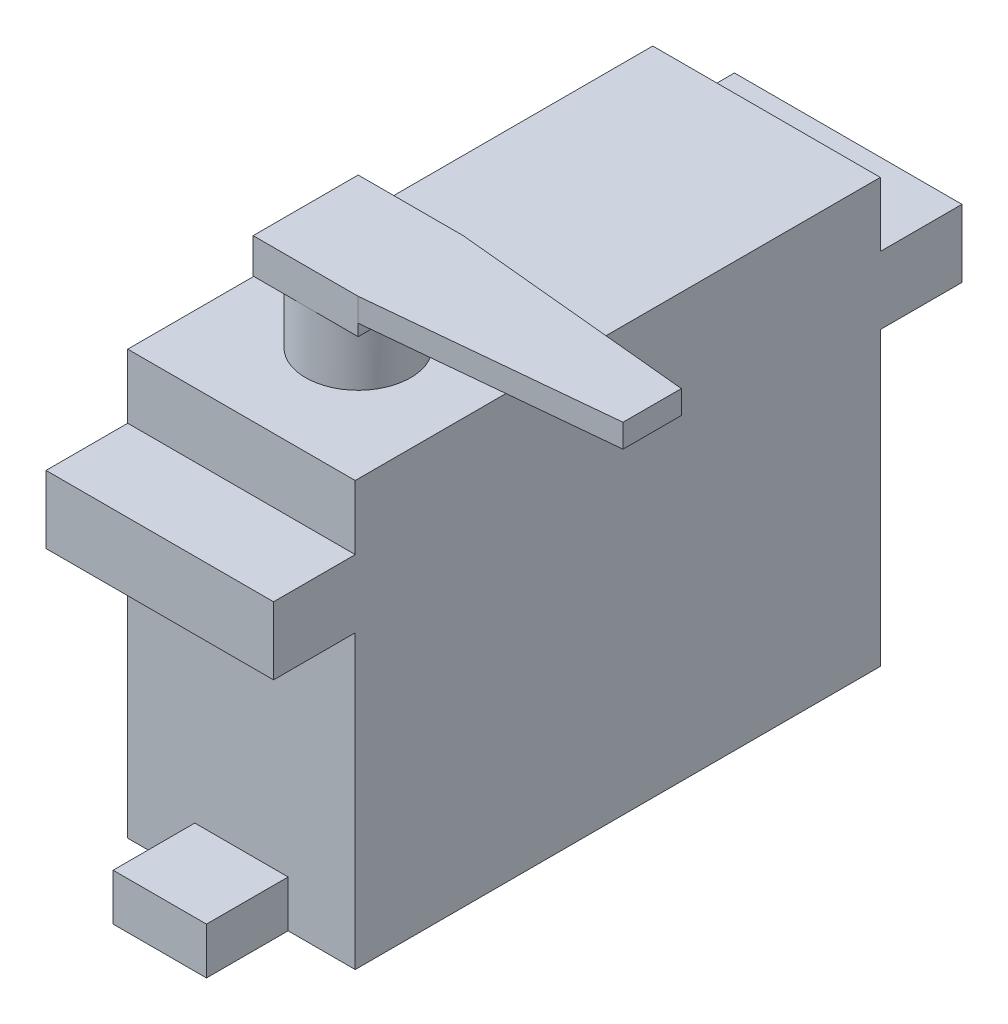
ISO-10303-21;
HEADER;
FILE_DESCRIPTION(('STEP AP214'),'2;1');
FILE_NAME('part.step','',(''),(''),'','','');
FILE_SCHEMA(('AUTOMOTIVE_DESIGN { 1 0 10303 214 1 1 1 1 }'));
ENDSEC;
DATA;
#1=APPLICATION_CONTEXT('core data for automotive mechanical design processes');
#2=APPLICATION_PROTOCOL_DEFINITION('international standard','automotive_design',2000,#1);
#3=PRODUCT_CONTEXT('',#1,'mechanical');
#4=PRODUCT('Part','Part','',(#3));
#5=PRODUCT_RELATED_PRODUCT_CATEGORY('part','',(#4));
#6=PRODUCT_DEFINITION_FORMATION('','',#4);
#7=PRODUCT_DEFINITION_CONTEXT('part definition',#1,'design');
#8=PRODUCT_DEFINITION('design','',#6,#7);
#9=PRODUCT_DEFINITION_SHAPE('','',#8);
#10=(LENGTH_UNIT() NAMED_UNIT(*) SI_UNIT(.MILLI.,.METRE.));
#11=(NAMED_UNIT(*) PLANE_ANGLE_UNIT() SI_UNIT($,.RADIAN.));
#12=(NAMED_UNIT(*) SI_UNIT($,.STERADIAN.) SOLID_ANGLE_UNIT());
#13=UNCERTAINTY_MEASURE_WITH_UNIT(LENGTH_MEASURE(1.E-05),#10,'distance_accuracy_value','');
#14=(GEOMETRIC_REPRESENTATION_CONTEXT(3) GLOBAL_UNCERTAINTY_ASSIGNED_CONTEXT((#13)) GLOBAL_UNIT_ASSIGNED_CONTEXT((#10,
#11,#12)) REPRESENTATION_CONTEXT('',''));
#15=CARTESIAN_POINT('',(0.,0.,0.));
#16=DIRECTION('',(0.,0.,1.));
#17=DIRECTION('',(1.,0.,0.));
#18=AXIS2_PLACEMENT_3D('',#15,#16,#17);
#19=CARTESIAN_POINT('',(19.5,36.3,-45.));
#20=DIRECTION('',(0.,-1.,0.));
#21=DIRECTION('',(0.,0.,-1.));
#22=AXIS2_PLACEMENT_3D('',#19,#20,#21);
#23=PLANE('',#22);
#24=DIRECTION('',(0.,0.,1.));
#25=VECTOR('',#24,1.);
#26=CARTESIAN_POINT('',(0.,36.3,-45.));
#27=LINE('',#26,#25);
#28=CARTESIAN_POINT('',(0.,36.3,-45.));
#29=VERTEX_POINT('',#28);
#30=CARTESIAN_POINT('',(0.,36.3,0.));
#31=VERTEX_POINT('',#30);
#32=EDGE_CURVE('E329',#29,#31,#27,.T.);
#33=ORIENTED_EDGE('',*,*,#32,.T.);
#34=DIRECTION('',(-1.,0.,0.));
#35=VECTOR('',#34,1.);
#36=CARTESIAN_POINT('',(19.5,36.3,0.));
#37=LINE('',#36,#35);
#38=CARTESIAN_POINT('',(19.5,36.3,0.));
#39=VERTEX_POINT('',#38);
#40=EDGE_CURVE('E349',#39,#31,#37,.T.);
#41=ORIENTED_EDGE('',*,*,#40,.F.);
#42=DIRECTION('',(0.,0.,1.));
#43=VECTOR('',#42,1.);
#44=CARTESIAN_POINT('',(19.5,36.3,-45.));
#45=LINE('',#44,#43);
#46=CARTESIAN_POINT('',(19.5,36.3,-45.));
#47=VERTEX_POINT('',#46);
#48=EDGE_CURVE('E304',#47,#39,#45,.T.);
#49=ORIENTED_EDGE('',*,*,#48,.F.);
#50=DIRECTION('',(-1.,0.,0.));
#51=VECTOR('',#50,1.);
#52=CARTESIAN_POINT('',(19.5,36.3,-45.));
#53=LINE('',#52,#51);
#54=EDGE_CURVE('E352',#47,#29,#53,.T.);
#55=ORIENTED_EDGE('',*,*,#54,.T.);
#56=EDGE_LOOP('',(#33,#41,#49,#55));
#57=FACE_BOUND('',#56,.T.);
#58=CARTESIAN_POINT('',(9.75,36.3,-10.));
#59=DIRECTION('',(0.,-1.,0.));
#60=DIRECTION('',(0.,0.,-1.));
#61=AXIS2_PLACEMENT_3D('',#58,#59,#60);
#62=CIRCLE('',#61,4.5);
#63=CARTESIAN_POINT('',(9.75,36.3,-14.5));
#64=VERTEX_POINT('',#63);
#65=EDGE_CURVE('E11',#64,#64,#62,.F.);
#66=ORIENTED_EDGE('',*,*,#65,.F.);
#67=EDGE_LOOP('',(#66));
#68=FACE_BOUND('',#67,.T.);
#69=ADVANCED_FACE('F32',(#57,#68),#23,.F.);
#70=CARTESIAN_POINT('',(19.5,25.,0.));
#71=DIRECTION('',(0.,0.,-1.));
#72=DIRECTION('',(-1.,0.,0.));
#73=AXIS2_PLACEMENT_3D('',#70,#71,#72);
#74=PLANE('',#73);
#75=DIRECTION('',(0.,1.,0.));
#76=VECTOR('',#75,1.);
#77=CARTESIAN_POINT('',(13.75,4.,0.));
#78=LINE('',#77,#76);
#79=CARTESIAN_POINT('',(13.75,0.,0.));
#80=VERTEX_POINT('',#79);
#81=CARTESIAN_POINT('',(13.75,4.,0.));
#82=VERTEX_POINT('',#81);
#83=EDGE_CURVE('E260',#80,#82,#78,.T.);
#84=ORIENTED_EDGE('',*,*,#83,.F.);
#85=DIRECTION('',(-1.,0.,0.));
#86=VECTOR('',#85,1.);
#87=CARTESIAN_POINT('',(19.5,0.,0.));
#88=LINE('',#87,#86);
#89=CARTESIAN_POINT('',(19.5,0.,0.));
#90=VERTEX_POINT('',#89);
#91=EDGE_CURVE('E40',#90,#80,#88,.T.);
#92=ORIENTED_EDGE('',*,*,#91,.F.);
#93=DIRECTION('',(0.,-1.,0.));
#94=VECTOR('',#93,1.);
#95=CARTESIAN_POINT('',(19.5,25.,0.));
#96=LINE('',#95,#94);
#97=CARTESIAN_POINT('',(19.5,25.,0.));
#98=VERTEX_POINT('',#97);
#99=EDGE_CURVE('E288',#98,#90,#96,.T.);
#100=ORIENTED_EDGE('',*,*,#99,.F.);
#101=DIRECTION('',(-1.,0.,0.));
#102=VECTOR('',#101,1.);
#103=CARTESIAN_POINT('',(19.5,25.,0.));
#104=LINE('',#103,#102);
#105=CARTESIAN_POINT('',(0.,25.,0.));
#106=VERTEX_POINT('',#105);
#107=EDGE_CURVE('E314',#98,#106,#104,.T.);
#108=ORIENTED_EDGE('',*,*,#107,.T.);
#109=DIRECTION('',(0.,-1.,0.));
#110=VECTOR('',#109,1.);
#111=CARTESIAN_POINT('',(0.,25.,0.));
#112=LINE('',#111,#110);
#113=CARTESIAN_POINT('',(0.,0.,0.));
#114=VERTEX_POINT('',#113);
#115=EDGE_CURVE('E287',#106,#114,#112,.T.);
#116=ORIENTED_EDGE('',*,*,#115,.T.);
#117=CARTESIAN_POINT('',(5.75,0.,0.));
#118=VERTEX_POINT('',#117);
#119=EDGE_CURVE('E369',#118,#114,#88,.T.);
#120=ORIENTED_EDGE('',*,*,#119,.F.);
#121=DIRECTION('',(0.,-1.,0.));
#122=VECTOR('',#121,1.);
#123=CARTESIAN_POINT('',(5.75,4.,0.));
#124=LINE('',#123,#122);
#125=CARTESIAN_POINT('',(5.75,4.,0.));
#126=VERTEX_POINT('',#125);
#127=EDGE_CURVE('E266',#126,#118,#124,.T.);
#128=ORIENTED_EDGE('',*,*,#127,.F.);
#129=DIRECTION('',(-1.,0.,0.));
#130=VECTOR('',#129,1.);
#131=CARTESIAN_POINT('',(5.75,4.,0.));
#132=LINE('',#131,#130);
#133=EDGE_CURVE('E275',#82,#126,#132,.T.);
#134=ORIENTED_EDGE('',*,*,#133,.F.);
#135=EDGE_LOOP('',(#84,#92,#100,#108,#116,#120,#128,#134));
#136=FACE_BOUND('',#135,.T.);
#137=ADVANCED_FACE('F34',(#136),#74,.F.);
#138=CARTESIAN_POINT('',(19.5,0.,0.));
#139=DIRECTION('',(0.,1.,0.));
#140=DIRECTION('',(0.,0.,1.));
#141=AXIS2_PLACEMENT_3D('',#138,#139,#140);
#142=PLANE('',#141);
#143=DIRECTION('',(0.,0.,-1.));
#144=VECTOR('',#143,1.);
#145=CARTESIAN_POINT('',(0.,0.,0.));
#146=LINE('',#145,#144);
#147=CARTESIAN_POINT('',(0.,0.,-45.));
#148=VERTEX_POINT('',#147);
#149=EDGE_CURVE('E317',#114,#148,#146,.T.);
#150=ORIENTED_EDGE('',*,*,#149,.T.);
#151=DIRECTION('',(-1.,0.,0.));
#152=VECTOR('',#151,1.);
#153=CARTESIAN_POINT('',(19.5,0.,-45.));
#154=LINE('',#153,#152);
#155=CARTESIAN_POINT('',(19.5,0.,-45.));
#156=VERTEX_POINT('',#155);
#157=EDGE_CURVE('E367',#156,#148,#154,.T.);
#158=ORIENTED_EDGE('',*,*,#157,.F.);
#159=DIRECTION('',(0.,0.,-1.));
#160=VECTOR('',#159,1.);
#161=CARTESIAN_POINT('',(19.5,0.,0.));
#162=LINE('',#161,#160);
#163=EDGE_CURVE('E291',#90,#156,#162,.T.);
#164=ORIENTED_EDGE('',*,*,#163,.F.);
#165=ORIENTED_EDGE('',*,*,#91,.T.);
#166=DIRECTION('',(0.,0.,-1.));
#167=VECTOR('',#166,1.);
#168=CARTESIAN_POINT('',(13.75,0.,7.));
#169=LINE('',#168,#167);
#170=CARTESIAN_POINT('',(13.75,0.,7.));
#171=VERTEX_POINT('',#170);
#172=EDGE_CURVE('E272',#171,#80,#169,.T.);
#173=ORIENTED_EDGE('',*,*,#172,.F.);
#174=DIRECTION('',(1.,0.,0.));
#175=VECTOR('',#174,1.);
#176=CARTESIAN_POINT('',(5.75,0.,7.));
#177=LINE('',#176,#175);
#178=CARTESIAN_POINT('',(5.75,0.,7.));
#179=VERTEX_POINT('',#178);
#180=EDGE_CURVE('E270',#179,#171,#177,.T.);
#181=ORIENTED_EDGE('',*,*,#180,.F.);
#182=DIRECTION('',(0.,0.,-1.));
#183=VECTOR('',#182,1.);
#184=CARTESIAN_POINT('',(5.75,0.,7.));
#185=LINE('',#184,#183);
#186=EDGE_CURVE('E280',#179,#118,#185,.T.);
#187=ORIENTED_EDGE('',*,*,#186,.T.);
#188=ORIENTED_EDGE('',*,*,#119,.T.);
#189=EDGE_LOOP('',(#150,#158,#164,#165,#173,#181,#187,#188));
#190=FACE_BOUND('',#189,.T.);
#191=ADVANCED_FACE('F376',(#190),#142,.F.);
#192=CARTESIAN_POINT('',(19.5,0.,-45.));
#193=DIRECTION('',(0.,0.,1.));
#194=DIRECTION('',(1.,0.,0.));
#195=AXIS2_PLACEMENT_3D('',#192,#193,#194);
#196=PLANE('',#195);
#197=DIRECTION('',(0.,1.,0.));
#198=VECTOR('',#197,1.);
#199=CARTESIAN_POINT('',(0.,0.,-45.));
#200=LINE('',#199,#198);
#201=CARTESIAN_POINT('',(0.,25.,-45.));
#202=VERTEX_POINT('',#201);
#203=EDGE_CURVE('E319',#148,#202,#200,.T.);
#204=ORIENTED_EDGE('',*,*,#203,.T.);
#205=DIRECTION('',(-1.,0.,0.));
#206=VECTOR('',#205,1.);
#207=CARTESIAN_POINT('',(19.5,25.,-45.));
#208=LINE('',#207,#206);
#209=CARTESIAN_POINT('',(19.5,25.,-45.));
#210=VERTEX_POINT('',#209);
#211=EDGE_CURVE('E364',#210,#202,#208,.T.);
#212=ORIENTED_EDGE('',*,*,#211,.F.);
#213=DIRECTION('',(0.,1.,0.));
#214=VECTOR('',#213,1.);
#215=CARTESIAN_POINT('',(19.5,0.,-45.));
#216=LINE('',#215,#214);
#217=EDGE_CURVE('E294',#156,#210,#216,.T.);
#218=ORIENTED_EDGE('',*,*,#217,.F.);
#219=ORIENTED_EDGE('',*,*,#157,.T.);
#220=EDGE_LOOP('',(#204,#212,#218,#219));
#221=FACE_BOUND('',#220,.T.);
#222=ADVANCED_FACE('F436',(#221),#196,.F.);
#223=CARTESIAN_POINT('',(19.5,25.,-45.));
#224=DIRECTION('',(0.,1.,0.));
#225=DIRECTION('',(0.,0.,1.));
#226=AXIS2_PLACEMENT_3D('',#223,#224,#225);
#227=PLANE('',#226);
#228=DIRECTION('',(0.,0.,-1.));
#229=VECTOR('',#228,1.);
#230=CARTESIAN_POINT('',(0.,25.,-45.));
#231=LINE('',#230,#229);
#232=CARTESIAN_POINT('',(0.,25.,-52.));
#233=VERTEX_POINT('',#232);
#234=EDGE_CURVE('E321',#202,#233,#231,.T.);
#235=ORIENTED_EDGE('',*,*,#234,.T.);
#236=DIRECTION('',(-1.,0.,0.));
#237=VECTOR('',#236,1.);
#238=CARTESIAN_POINT('',(19.5,25.,-52.));
#239=LINE('',#238,#237);
#240=CARTESIAN_POINT('',(19.5,25.,-52.));
#241=VERTEX_POINT('',#240);
#242=EDGE_CURVE('E361',#241,#233,#239,.T.);
#243=ORIENTED_EDGE('',*,*,#242,.F.);
#244=DIRECTION('',(0.,0.,-1.));
#245=VECTOR('',#244,1.);
#246=CARTESIAN_POINT('',(19.5,25.,-45.));
#247=LINE('',#246,#245);
#248=EDGE_CURVE('E296',#210,#241,#247,.T.);
#249=ORIENTED_EDGE('',*,*,#248,.F.);
#250=ORIENTED_EDGE('',*,*,#211,.T.);
#251=EDGE_LOOP('',(#235,#243,#249,#250));
#252=FACE_BOUND('',#251,.T.);
#253=ADVANCED_FACE('F432',(#252),#227,.F.);
#254=CARTESIAN_POINT('',(19.5,25.,-52.));
#255=DIRECTION('',(0.,0.,1.));
#256=DIRECTION('',(1.,0.,0.));
#257=AXIS2_PLACEMENT_3D('',#254,#255,#256);
#258=PLANE('',#257);
#259=DIRECTION('',(0.,1.,0.));
#260=VECTOR('',#259,1.);
#261=CARTESIAN_POINT('',(0.,25.,-52.));
#262=LINE('',#261,#260);
#263=CARTESIAN_POINT('',(0.,30.8,-52.));
#264=VERTEX_POINT('',#263);
#265=EDGE_CURVE('E323',#233,#264,#262,.T.);
#266=ORIENTED_EDGE('',*,*,#265,.T.);
#267=DIRECTION('',(-1.,0.,0.));
#268=VECTOR('',#267,1.);
#269=CARTESIAN_POINT('',(19.5,30.8,-52.));
#270=LINE('',#269,#268);
#271=CARTESIAN_POINT('',(19.5,30.8,-52.));
#272=VERTEX_POINT('',#271);
#273=EDGE_CURVE('E358',#272,#264,#270,.T.);
#274=ORIENTED_EDGE('',*,*,#273,.F.);
#275=DIRECTION('',(0.,1.,0.));
#276=VECTOR('',#275,1.);
#277=CARTESIAN_POINT('',(19.5,25.,-52.));
#278=LINE('',#277,#276);
#279=EDGE_CURVE('E298',#241,#272,#278,.T.);
#280=ORIENTED_EDGE('',*,*,#279,.F.);
#281=ORIENTED_EDGE('',*,*,#242,.T.);
#282=EDGE_LOOP('',(#266,#274,#280,#281));
#283=FACE_BOUND('',#282,.T.);
#284=ADVANCED_FACE('F427',(#283),#258,.F.);
#285=CARTESIAN_POINT('',(19.5,30.8,-52.));
#286=DIRECTION('',(0.,-1.,0.));
#287=DIRECTION('',(0.,0.,-1.));
#288=AXIS2_PLACEMENT_3D('',#285,#286,#287);
#289=PLANE('',#288);
#290=DIRECTION('',(0.,0.,1.));
#291=VECTOR('',#290,1.);
#292=CARTESIAN_POINT('',(0.,30.8,-52.));
#293=LINE('',#292,#291);
#294=CARTESIAN_POINT('',(0.,30.8,-45.));
#295=VERTEX_POINT('',#294);
#296=EDGE_CURVE('E325',#264,#295,#293,.T.);
#297=ORIENTED_EDGE('',*,*,#296,.T.);
#298=DIRECTION('',(-1.,0.,0.));
#299=VECTOR('',#298,1.);
#300=CARTESIAN_POINT('',(19.5,30.8,-45.));
#301=LINE('',#300,#299);
#302=CARTESIAN_POINT('',(19.5,30.8,-45.));
#303=VERTEX_POINT('',#302);
#304=EDGE_CURVE('E355',#303,#295,#301,.T.);
#305=ORIENTED_EDGE('',*,*,#304,.F.);
#306=DIRECTION('',(0.,0.,1.));
#307=VECTOR('',#306,1.);
#308=CARTESIAN_POINT('',(19.5,30.8,-52.));
#309=LINE('',#308,#307);
#310=EDGE_CURVE('E300',#272,#303,#309,.T.);
#311=ORIENTED_EDGE('',*,*,#310,.F.);
#312=ORIENTED_EDGE('',*,*,#273,.T.);
#313=EDGE_LOOP('',(#297,#305,#311,#312));
#314=FACE_BOUND('',#313,.T.);
#315=ADVANCED_FACE('F423',(#314),#289,.F.);
#316=CARTESIAN_POINT('',(19.5,30.8,-45.));
#317=DIRECTION('',(0.,0.,1.));
#318=DIRECTION('',(1.,0.,0.));
#319=AXIS2_PLACEMENT_3D('',#316,#317,#318);
#320=PLANE('',#319);
#321=DIRECTION('',(0.,1.,0.));
#322=VECTOR('',#321,1.);
#323=CARTESIAN_POINT('',(0.,30.8,-45.));
#324=LINE('',#323,#322);
#325=EDGE_CURVE('E327',#295,#29,#324,.T.);
#326=ORIENTED_EDGE('',*,*,#325,.T.);
#327=ORIENTED_EDGE('',*,*,#54,.F.);
#328=DIRECTION('',(0.,1.,0.));
#329=VECTOR('',#328,1.);
#330=CARTESIAN_POINT('',(19.5,30.8,-45.));
#331=LINE('',#330,#329);
#332=EDGE_CURVE('E302',#303,#47,#331,.T.);
#333=ORIENTED_EDGE('',*,*,#332,.F.);
#334=ORIENTED_EDGE('',*,*,#304,.T.);
#335=EDGE_LOOP('',(#326,#327,#333,#334));
#336=FACE_BOUND('',#335,.T.);
#337=ADVANCED_FACE('F419',(#336),#320,.F.);
#338=CARTESIAN_POINT('',(19.5,36.3,0.));
#339=DIRECTION('',(0.,0.,-1.));
#340=DIRECTION('',(-1.,0.,0.));
#341=AXIS2_PLACEMENT_3D('',#338,#339,#340);
#342=PLANE('',#341);
#343=DIRECTION('',(0.,-1.,0.));
#344=VECTOR('',#343,1.);
#345=CARTESIAN_POINT('',(0.,36.3,0.));
#346=LINE('',#345,#344);
#347=CARTESIAN_POINT('',(0.,30.8,0.));
#348=VERTEX_POINT('',#347);
#349=EDGE_CURVE('E331',#31,#348,#346,.T.);
#350=ORIENTED_EDGE('',*,*,#349,.T.);
#351=DIRECTION('',(-1.,0.,0.));
#352=VECTOR('',#351,1.);
#353=CARTESIAN_POINT('',(19.5,30.8,0.));
#354=LINE('',#353,#352);
#355=CARTESIAN_POINT('',(19.5,30.8,0.));
#356=VERTEX_POINT('',#355);
#357=EDGE_CURVE('E346',#356,#348,#354,.T.);
#358=ORIENTED_EDGE('',*,*,#357,.F.);
#359=DIRECTION('',(0.,-1.,0.));
#360=VECTOR('',#359,1.);
#361=CARTESIAN_POINT('',(19.5,36.3,0.));
#362=LINE('',#361,#360);
#363=EDGE_CURVE('E306',#39,#356,#362,.T.);
#364=ORIENTED_EDGE('',*,*,#363,.F.);
#365=ORIENTED_EDGE('',*,*,#40,.T.);
#366=EDGE_LOOP('',(#350,#358,#364,#365));
#367=FACE_BOUND('',#366,.T.);
#368=ADVANCED_FACE('F408',(#367),#342,.F.);
#369=CARTESIAN_POINT('',(19.5,30.8,0.));
#370=DIRECTION('',(0.,-1.,0.));
#371=DIRECTION('',(0.,0.,-1.));
#372=AXIS2_PLACEMENT_3D('',#369,#370,#371);
#373=PLANE('',#372);
#374=DIRECTION('',(0.,0.,1.));
#375=VECTOR('',#374,1.);
#376=CARTESIAN_POINT('',(0.,30.8,0.));
#377=LINE('',#376,#375);
#378=CARTESIAN_POINT('',(0.,30.8,7.));
#379=VERTEX_POINT('',#378);
#380=EDGE_CURVE('E333',#348,#379,#377,.T.);
#381=ORIENTED_EDGE('',*,*,#380,.T.);
#382=DIRECTION('',(-1.,0.,0.));
#383=VECTOR('',#382,1.);
#384=CARTESIAN_POINT('',(19.5,30.8,7.));
#385=LINE('',#384,#383);
#386=CARTESIAN_POINT('',(19.5,30.8,7.));
#387=VERTEX_POINT('',#386);
#388=EDGE_CURVE('E343',#387,#379,#385,.T.);
#389=ORIENTED_EDGE('',*,*,#388,.F.);
#390=DIRECTION('',(0.,0.,1.));
#391=VECTOR('',#390,1.);
#392=CARTESIAN_POINT('',(19.5,30.8,0.));
#393=LINE('',#392,#391);
#394=EDGE_CURVE('E308',#356,#387,#393,.T.);
#395=ORIENTED_EDGE('',*,*,#394,.F.);
#396=ORIENTED_EDGE('',*,*,#357,.T.);
#397=EDGE_LOOP('',(#381,#389,#395,#396));
#398=FACE_BOUND('',#397,.T.);
#399=ADVANCED_FACE('F404',(#398),#373,.F.);
#400=CARTESIAN_POINT('',(19.5,30.8,7.));
#401=DIRECTION('',(0.,0.,-1.));
#402=DIRECTION('',(-1.,0.,0.));
#403=AXIS2_PLACEMENT_3D('',#400,#401,#402);
#404=PLANE('',#403);
#405=DIRECTION('',(0.,-1.,0.));
#406=VECTOR('',#405,1.);
#407=CARTESIAN_POINT('',(0.,30.8,7.));
#408=LINE('',#407,#406);
#409=CARTESIAN_POINT('',(0.,25.,7.));
#410=VERTEX_POINT('',#409);
#411=EDGE_CURVE('E335',#379,#410,#408,.T.);
#412=ORIENTED_EDGE('',*,*,#411,.T.);
#413=DIRECTION('',(-1.,0.,0.));
#414=VECTOR('',#413,1.);
#415=CARTESIAN_POINT('',(19.5,25.,7.));
#416=LINE('',#415,#414);
#417=CARTESIAN_POINT('',(19.5,25.,7.));
#418=VERTEX_POINT('',#417);
#419=EDGE_CURVE('E340',#418,#410,#416,.T.);
#420=ORIENTED_EDGE('',*,*,#419,.F.);
#421=DIRECTION('',(0.,-1.,0.));
#422=VECTOR('',#421,1.);
#423=CARTESIAN_POINT('',(19.5,30.8,7.));
#424=LINE('',#423,#422);
#425=EDGE_CURVE('E310',#387,#418,#424,.T.);
#426=ORIENTED_EDGE('',*,*,#425,.F.);
#427=ORIENTED_EDGE('',*,*,#388,.T.);
#428=EDGE_LOOP('',(#412,#420,#426,#427));
#429=FACE_BOUND('',#428,.T.);
#430=ADVANCED_FACE('F399',(#429),#404,.F.);
#431=CARTESIAN_POINT('',(19.5,25.,7.));
#432=DIRECTION('',(0.,1.,0.));
#433=DIRECTION('',(0.,0.,1.));
#434=AXIS2_PLACEMENT_3D('',#431,#432,#433);
#435=PLANE('',#434);
#436=DIRECTION('',(0.,0.,-1.));
#437=VECTOR('',#436,1.);
#438=CARTESIAN_POINT('',(0.,25.,7.));
#439=LINE('',#438,#437);
#440=EDGE_CURVE('E292',#410,#106,#439,.T.);
#441=ORIENTED_EDGE('',*,*,#440,.T.);
#442=ORIENTED_EDGE('',*,*,#107,.F.);
#443=DIRECTION('',(0.,0.,-1.));
#444=VECTOR('',#443,1.);
#445=CARTESIAN_POINT('',(19.5,25.,7.));
#446=LINE('',#445,#444);
#447=EDGE_CURVE('E312',#418,#98,#446,.T.);
#448=ORIENTED_EDGE('',*,*,#447,.F.);
#449=ORIENTED_EDGE('',*,*,#419,.T.);
#450=EDGE_LOOP('',(#441,#442,#448,#449));
#451=FACE_BOUND('',#450,.T.);
#452=ADVANCED_FACE('F393',(#451),#435,.F.);
#453=CARTESIAN_POINT('',(19.5,0.,0.));
#454=DIRECTION('',(1.,0.,0.));
#455=DIRECTION('',(0.,0.,-1.));
#456=AXIS2_PLACEMENT_3D('',#453,#454,#455);
#457=PLANE('',#456);
#458=ORIENTED_EDGE('',*,*,#99,.T.);
#459=ORIENTED_EDGE('',*,*,#163,.T.);
#460=ORIENTED_EDGE('',*,*,#217,.T.);
#461=ORIENTED_EDGE('',*,*,#248,.T.);
#462=ORIENTED_EDGE('',*,*,#279,.T.);
#463=ORIENTED_EDGE('',*,*,#310,.T.);
#464=ORIENTED_EDGE('',*,*,#332,.T.);
#465=ORIENTED_EDGE('',*,*,#48,.T.);
#466=ORIENTED_EDGE('',*,*,#363,.T.);
#467=ORIENTED_EDGE('',*,*,#394,.T.);
#468=ORIENTED_EDGE('',*,*,#425,.T.);
#469=ORIENTED_EDGE('',*,*,#447,.T.);
#470=EDGE_LOOP('',(#458,#459,#460,#461,#462,#463,#464,#465,#466,#467,#468,#469));
#471=FACE_BOUND('',#470,.T.);
#472=ADVANCED_FACE('F438',(#471),#457,.T.);
#473=CARTESIAN_POINT('',(0.,0.,0.));
#474=DIRECTION('',(1.,0.,0.));
#475=DIRECTION('',(0.,0.,-1.));
#476=AXIS2_PLACEMENT_3D('',#473,#474,#475);
#477=PLANE('',#476);
#478=ORIENTED_EDGE('',*,*,#115,.F.);
#479=ORIENTED_EDGE('',*,*,#440,.F.);
#480=ORIENTED_EDGE('',*,*,#411,.F.);
#481=ORIENTED_EDGE('',*,*,#380,.F.);
#482=ORIENTED_EDGE('',*,*,#349,.F.);
#483=ORIENTED_EDGE('',*,*,#32,.F.);
#484=ORIENTED_EDGE('',*,*,#325,.F.);
#485=ORIENTED_EDGE('',*,*,#296,.F.);
#486=ORIENTED_EDGE('',*,*,#265,.F.);
#487=ORIENTED_EDGE('',*,*,#234,.F.);
#488=ORIENTED_EDGE('',*,*,#203,.F.);
#489=ORIENTED_EDGE('',*,*,#149,.F.);
#490=EDGE_LOOP('',(#478,#479,#480,#481,#482,#483,#484,#485,#486,#487,#488,#489));
#491=FACE_BOUND('',#490,.T.);
#492=ADVANCED_FACE('F385',(#491),#477,.F.);
#493=CARTESIAN_POINT('',(13.75,4.,7.));
#494=DIRECTION('',(-1.,0.,0.));
#495=DIRECTION('',(0.,0.,1.));
#496=AXIS2_PLACEMENT_3D('',#493,#494,#495);
#497=PLANE('',#496);
#498=ORIENTED_EDGE('',*,*,#83,.T.);
#499=DIRECTION('',(0.,0.,-1.));
#500=VECTOR('',#499,1.);
#501=CARTESIAN_POINT('',(13.75,4.,7.));
#502=LINE('',#501,#500);
#503=CARTESIAN_POINT('',(13.75,4.,7.));
#504=VERTEX_POINT('',#503);
#505=EDGE_CURVE('E285',#504,#82,#502,.T.);
#506=ORIENTED_EDGE('',*,*,#505,.F.);
#507=DIRECTION('',(0.,1.,0.));
#508=VECTOR('',#507,1.);
#509=CARTESIAN_POINT('',(13.75,4.,7.));
#510=LINE('',#509,#508);
#511=EDGE_CURVE('E262',#171,#504,#510,.T.);
#512=ORIENTED_EDGE('',*,*,#511,.F.);
#513=ORIENTED_EDGE('',*,*,#172,.T.);
#514=EDGE_LOOP('',(#498,#506,#512,#513));
#515=FACE_BOUND('',#514,.T.);
#516=ADVANCED_FACE('F442',(#515),#497,.F.);
#517=CARTESIAN_POINT('',(5.75,4.,7.));
#518=DIRECTION('',(0.,-1.,0.));
#519=DIRECTION('',(0.,0.,-1.));
#520=AXIS2_PLACEMENT_3D('',#517,#518,#519);
#521=PLANE('',#520);
#522=ORIENTED_EDGE('',*,*,#133,.T.);
#523=DIRECTION('',(0.,0.,-1.));
#524=VECTOR('',#523,1.);
#525=CARTESIAN_POINT('',(5.75,4.,7.));
#526=LINE('',#525,#524);
#527=CARTESIAN_POINT('',(5.75,4.,7.));
#528=VERTEX_POINT('',#527);
#529=EDGE_CURVE('E282',#528,#126,#526,.T.);
#530=ORIENTED_EDGE('',*,*,#529,.F.);
#531=DIRECTION('',(-1.,0.,0.));
#532=VECTOR('',#531,1.);
#533=CARTESIAN_POINT('',(5.75,4.,7.));
#534=LINE('',#533,#532);
#535=EDGE_CURVE('E265',#504,#528,#534,.T.);
#536=ORIENTED_EDGE('',*,*,#535,.F.);
#537=ORIENTED_EDGE('',*,*,#505,.T.);
#538=EDGE_LOOP('',(#522,#530,#536,#537));
#539=FACE_BOUND('',#538,.T.);
#540=ADVANCED_FACE('F451',(#539),#521,.F.);
#541=CARTESIAN_POINT('',(5.75,4.,7.));
#542=DIRECTION('',(1.,0.,0.));
#543=DIRECTION('',(0.,0.,-1.));
#544=AXIS2_PLACEMENT_3D('',#541,#542,#543);
#545=PLANE('',#544);
#546=ORIENTED_EDGE('',*,*,#127,.T.);
#547=ORIENTED_EDGE('',*,*,#186,.F.);
#548=DIRECTION('',(0.,-1.,0.));
#549=VECTOR('',#548,1.);
#550=CARTESIAN_POINT('',(5.75,4.,7.));
#551=LINE('',#550,#549);
#552=EDGE_CURVE('E268',#528,#179,#551,.T.);
#553=ORIENTED_EDGE('',*,*,#552,.F.);
#554=ORIENTED_EDGE('',*,*,#529,.T.);
#555=EDGE_LOOP('',(#546,#547,#553,#554));
#556=FACE_BOUND('',#555,.T.);
#557=ADVANCED_FACE('F449',(#556),#545,.F.);
#558=CARTESIAN_POINT('',(0.,0.,7.));
#559=DIRECTION('',(0.,0.,1.));
#560=DIRECTION('',(1.,0.,0.));
#561=AXIS2_PLACEMENT_3D('',#558,#559,#560);
#562=PLANE('',#561);
#563=ORIENTED_EDGE('',*,*,#511,.T.);
#564=ORIENTED_EDGE('',*,*,#535,.T.);
#565=ORIENTED_EDGE('',*,*,#552,.T.);
#566=ORIENTED_EDGE('',*,*,#180,.T.);
#567=EDGE_LOOP('',(#563,#564,#565,#566));
#568=FACE_BOUND('',#567,.T.);
#569=ADVANCED_FACE('F445',(#568),#562,.T.);
#570=CARTESIAN_POINT('',(9.75,41.6,-10.));
#571=DIRECTION('',(0.,-1.,0.));
#572=DIRECTION('',(0.,0.,-1.));
#573=AXIS2_PLACEMENT_3D('',#570,#571,#572);
#574=CYLINDRICAL_SURFACE('',#573,4.5);
#575=CARTESIAN_POINT('',(9.75,41.6,-10.));
#576=DIRECTION('',(0.,1.,0.));
#577=DIRECTION('',(0.,0.,1.));
#578=AXIS2_PLACEMENT_3D('',#575,#576,#577);
#579=CIRCLE('',#578,4.5);
#580=CARTESIAN_POINT('',(9.75,41.6,-5.5));
#581=VERTEX_POINT('',#580);
#582=CARTESIAN_POINT('',(14.25,41.6,-10.));
#583=VERTEX_POINT('',#582);
#584=EDGE_CURVE('E257',#581,#583,#579,.T.);
#585=ORIENTED_EDGE('',*,*,#584,.F.);
#586=CARTESIAN_POINT('',(5.25,41.6,-10.));
#587=VERTEX_POINT('',#586);
#588=EDGE_CURVE('E47',#587,#581,#579,.T.);
#589=ORIENTED_EDGE('',*,*,#588,.F.);
#590=CARTESIAN_POINT('',(9.75,41.6,-14.5));
#591=VERTEX_POINT('',#590);
#592=EDGE_CURVE('E51',#591,#587,#579,.T.);
#593=ORIENTED_EDGE('',*,*,#592,.F.);
#594=EDGE_CURVE('E261',#583,#591,#579,.T.);
#595=ORIENTED_EDGE('',*,*,#594,.F.);
#596=EDGE_LOOP('',(#585,#589,#593,#595));
#597=FACE_BOUND('',#596,.T.);
#598=ORIENTED_EDGE('',*,*,#65,.T.);
#599=EDGE_LOOP('',(#598));
#600=FACE_BOUND('',#599,.T.);
#601=ADVANCED_FACE('F558',(#597,#600),#574,.T.);
#602=CARTESIAN_POINT('',(0.,41.6,0.));
#603=DIRECTION('',(0.,1.,0.));
#604=DIRECTION('',(0.,0.,1.));
#605=AXIS2_PLACEMENT_3D('',#602,#603,#604);
#606=PLANE('',#605);
#607=DIRECTION('',(1.,0.,0.));
#608=VECTOR('',#607,1.);
#609=CARTESIAN_POINT('',(14.25,41.6,-5.5));
#610=LINE('',#609,#608);
#611=CARTESIAN_POINT('',(14.25,41.6,-5.5));
#612=VERTEX_POINT('',#611);
#613=EDGE_CURVE('E239',#581,#612,#610,.T.);
#614=ORIENTED_EDGE('',*,*,#613,.F.);
#615=ORIENTED_EDGE('',*,*,#584,.T.);
#616=DIRECTION('',(0.,0.,-1.));
#617=VECTOR('',#616,1.);
#618=CARTESIAN_POINT('',(14.25,41.6,-5.5));
#619=LINE('',#618,#617);
#620=EDGE_CURVE('E243',#612,#583,#619,.T.);
#621=ORIENTED_EDGE('',*,*,#620,.F.);
#622=EDGE_LOOP('',(#614,#615,#621));
#623=FACE_BOUND('',#622,.T.);
#624=ADVANCED_FACE('F572',(#623),#606,.F.);
#625=CARTESIAN_POINT('',(14.25,41.6,-14.5));
#626=VERTEX_POINT('',#625);
#627=EDGE_CURVE('E242',#583,#626,#619,.T.);
#628=ORIENTED_EDGE('',*,*,#627,.F.);
#629=ORIENTED_EDGE('',*,*,#594,.T.);
#630=DIRECTION('',(-1.,0.,0.));
#631=VECTOR('',#630,1.);
#632=CARTESIAN_POINT('',(14.25,41.6,-14.5));
#633=LINE('',#632,#631);
#634=EDGE_CURVE('E236',#626,#591,#633,.T.);
#635=ORIENTED_EDGE('',*,*,#634,.F.);
#636=EDGE_LOOP('',(#628,#629,#635));
#637=FACE_BOUND('',#636,.T.);
#638=ADVANCED_FACE('F581',(#637),#606,.F.);
#639=CARTESIAN_POINT('',(5.25,41.6,-14.5));
#640=VERTEX_POINT('',#639);
#641=EDGE_CURVE('E246',#591,#640,#633,.T.);
#642=ORIENTED_EDGE('',*,*,#641,.F.);
#643=ORIENTED_EDGE('',*,*,#592,.T.);
#644=DIRECTION('',(0.,0.,1.));
#645=VECTOR('',#644,1.);
#646=CARTESIAN_POINT('',(5.25,41.6,-5.5));
#647=LINE('',#646,#645);
#648=EDGE_CURVE('E227',#640,#587,#647,.T.);
#649=ORIENTED_EDGE('',*,*,#648,.F.);
#650=EDGE_LOOP('',(#642,#643,#649));
#651=FACE_BOUND('',#650,.T.);
#652=ADVANCED_FACE('F592',(#651),#606,.F.);
#653=CARTESIAN_POINT('',(5.25,41.6,-5.5));
#654=VERTEX_POINT('',#653);
#655=EDGE_CURVE('E225',#587,#654,#647,.T.);
#656=ORIENTED_EDGE('',*,*,#655,.F.);
#657=ORIENTED_EDGE('',*,*,#588,.T.);
#658=EDGE_CURVE('E240',#654,#581,#610,.T.);
#659=ORIENTED_EDGE('',*,*,#658,.F.);
#660=EDGE_LOOP('',(#656,#657,#659));
#661=FACE_BOUND('',#660,.T.);
#662=ADVANCED_FACE('F584',(#661),#606,.F.);
#663=CARTESIAN_POINT('',(5.25,42.6,-5.5));
#664=DIRECTION('',(1.,0.,0.));
#665=DIRECTION('',(0.,0.,-1.));
#666=AXIS2_PLACEMENT_3D('',#663,#664,#665);
#667=PLANE('',#666);
#668=ORIENTED_EDGE('',*,*,#648,.T.);
#669=ORIENTED_EDGE('',*,*,#655,.T.);
#670=DIRECTION('',(0.,-1.,0.));
#671=VECTOR('',#670,1.);
#672=CARTESIAN_POINT('',(5.25,42.6,-5.5));
#673=LINE('',#672,#671);
#674=CARTESIAN_POINT('',(5.25,44.6,-5.5));
#675=VERTEX_POINT('',#674);
#676=EDGE_CURVE('E255',#675,#654,#673,.T.);
#677=ORIENTED_EDGE('',*,*,#676,.F.);
#678=DIRECTION('',(0.,0.,1.));
#679=VECTOR('',#678,1.);
#680=CARTESIAN_POINT('',(5.25,44.6,-14.5));
#681=LINE('',#680,#679);
#682=CARTESIAN_POINT('',(5.25,44.6,-14.5));
#683=VERTEX_POINT('',#682);
#684=EDGE_CURVE('E215',#683,#675,#681,.T.);
#685=ORIENTED_EDGE('',*,*,#684,.F.);
#686=DIRECTION('',(0.,-1.,0.));
#687=VECTOR('',#686,1.);
#688=CARTESIAN_POINT('',(5.25,42.6,-14.5));
#689=LINE('',#688,#687);
#690=EDGE_CURVE('E235',#683,#640,#689,.T.);
#691=ORIENTED_EDGE('',*,*,#690,.T.);
#692=EDGE_LOOP('',(#668,#669,#677,#685,#691));
#693=FACE_BOUND('',#692,.T.);
#694=ADVANCED_FACE('F609',(#693),#667,.F.);
#695=CARTESIAN_POINT('',(14.25,42.6,-5.5));
#696=DIRECTION('',(0.,0.,-1.));
#697=DIRECTION('',(-1.,0.,0.));
#698=AXIS2_PLACEMENT_3D('',#695,#696,#697);
#699=PLANE('',#698);
#700=ORIENTED_EDGE('',*,*,#658,.T.);
#701=ORIENTED_EDGE('',*,*,#613,.T.);
#702=DIRECTION('',(0.,-1.,0.));
#703=VECTOR('',#702,1.);
#704=CARTESIAN_POINT('',(14.25,42.6,-5.5));
#705=LINE('',#704,#703);
#706=CARTESIAN_POINT('',(14.25,42.6,-5.5));
#707=VERTEX_POINT('',#706);
#708=EDGE_CURVE('E223',#707,#612,#705,.T.);
#709=ORIENTED_EDGE('',*,*,#708,.F.);
#710=DIRECTION('',(0.,-1.,0.));
#711=VECTOR('',#710,1.);
#712=CARTESIAN_POINT('',(14.25,44.6,-5.5));
#713=LINE('',#712,#711);
#714=CARTESIAN_POINT('',(14.25,44.6,-5.5));
#715=VERTEX_POINT('',#714);
#716=EDGE_CURVE('E202',#715,#707,#713,.T.);
#717=ORIENTED_EDGE('',*,*,#716,.F.);
#718=DIRECTION('',(1.,0.,0.));
#719=VECTOR('',#718,1.);
#720=CARTESIAN_POINT('',(5.25,44.6,-5.5));
#721=LINE('',#720,#719);
#722=EDGE_CURVE('E208',#675,#715,#721,.T.);
#723=ORIENTED_EDGE('',*,*,#722,.F.);
#724=ORIENTED_EDGE('',*,*,#676,.T.);
#725=EDGE_LOOP('',(#700,#701,#709,#717,#723,#724));
#726=FACE_BOUND('',#725,.T.);
#727=ADVANCED_FACE('F221',(#726),#699,.F.);
#728=CARTESIAN_POINT('',(14.25,42.6,-5.5));
#729=DIRECTION('',(-1.,0.,0.));
#730=DIRECTION('',(0.,0.,1.));
#731=AXIS2_PLACEMENT_3D('',#728,#729,#730);
#732=PLANE('',#731);
#733=ORIENTED_EDGE('',*,*,#620,.T.);
#734=ORIENTED_EDGE('',*,*,#627,.T.);
#735=DIRECTION('',(0.,-1.,0.));
#736=VECTOR('',#735,1.);
#737=CARTESIAN_POINT('',(14.25,42.6,-14.5));
#738=LINE('',#737,#736);
#739=CARTESIAN_POINT('',(14.25,42.6,-14.5));
#740=VERTEX_POINT('',#739);
#741=EDGE_CURVE('E251',#740,#626,#738,.T.);
#742=ORIENTED_EDGE('',*,*,#741,.F.);
#743=DIRECTION('',(0.,0.,-1.));
#744=VECTOR('',#743,1.);
#745=CARTESIAN_POINT('',(14.25,42.6,-5.5));
#746=LINE('',#745,#744);
#747=EDGE_CURVE('E233',#707,#740,#746,.T.);
#748=ORIENTED_EDGE('',*,*,#747,.F.);
#749=ORIENTED_EDGE('',*,*,#708,.T.);
#750=EDGE_LOOP('',(#733,#734,#742,#748,#749));
#751=FACE_BOUND('',#750,.T.);
#752=ADVANCED_FACE('F629',(#751),#732,.F.);
#753=CARTESIAN_POINT('',(14.25,42.6,-14.5));
#754=DIRECTION('',(0.,0.,1.));
#755=DIRECTION('',(1.,0.,0.));
#756=AXIS2_PLACEMENT_3D('',#753,#754,#755);
#757=PLANE('',#756);
#758=ORIENTED_EDGE('',*,*,#634,.T.);
#759=ORIENTED_EDGE('',*,*,#641,.T.);
#760=ORIENTED_EDGE('',*,*,#690,.F.);
#761=DIRECTION('',(1.,0.,0.));
#762=VECTOR('',#761,1.);
#763=CARTESIAN_POINT('',(5.25,44.6,-14.5));
#764=LINE('',#763,#762);
#765=CARTESIAN_POINT('',(14.25,44.6,-14.5));
#766=VERTEX_POINT('',#765);
#767=EDGE_CURVE('E719',#683,#766,#764,.T.);
#768=ORIENTED_EDGE('',*,*,#767,.T.);
#769=DIRECTION('',(0.,-1.,0.));
#770=VECTOR('',#769,1.);
#771=CARTESIAN_POINT('',(14.25,44.6,-14.5));
#772=LINE('',#771,#770);
#773=EDGE_CURVE('E712',#766,#740,#772,.T.);
#774=ORIENTED_EDGE('',*,*,#773,.T.);
#775=ORIENTED_EDGE('',*,*,#741,.T.);
#776=EDGE_LOOP('',(#758,#759,#760,#768,#774,#775));
#777=FACE_BOUND('',#776,.T.);
#778=ADVANCED_FACE('F640',(#777),#757,.F.);
#779=CARTESIAN_POINT('',(14.25,44.6,-5.5));
#780=DIRECTION('',(-0.0961705191712051,0.,-0.995364873421973));
#781=DIRECTION('',(-0.995364873421973,0.,0.0961705191712051));
#782=AXIS2_PLACEMENT_3D('',#779,#780,#781);
#783=PLANE('',#782);
#784=DIRECTION('',(0.995364873421973,0.,-0.0961705191712051));
#785=VECTOR('',#784,1.);
#786=CARTESIAN_POINT('',(14.25,42.6,-5.5));
#787=LINE('',#786,#785);
#788=CARTESIAN_POINT('',(34.95,42.6,-7.5));
#789=VERTEX_POINT('',#788);
#790=EDGE_CURVE('E701',#707,#789,#787,.T.);
#791=ORIENTED_EDGE('',*,*,#790,.T.);
#792=DIRECTION('',(0.,-1.,0.));
#793=VECTOR('',#792,1.);
#794=CARTESIAN_POINT('',(34.95,44.6,-7.5));
#795=LINE('',#794,#793);
#796=CARTESIAN_POINT('',(34.95,44.6,-7.5));
#797=VERTEX_POINT('',#796);
#798=EDGE_CURVE('E204',#797,#789,#795,.T.);
#799=ORIENTED_EDGE('',*,*,#798,.F.);
#800=DIRECTION('',(0.995364873421973,0.,-0.0961705191712051));
#801=VECTOR('',#800,1.);
#802=CARTESIAN_POINT('',(14.25,44.6,-5.5));
#803=LINE('',#802,#801);
#804=EDGE_CURVE('E197',#715,#797,#803,.T.);
#805=ORIENTED_EDGE('',*,*,#804,.F.);
#806=ORIENTED_EDGE('',*,*,#716,.T.);
#807=EDGE_LOOP('',(#791,#799,#805,#806));
#808=FACE_BOUND('',#807,.T.);
#809=ADVANCED_FACE('F200',(#808),#783,.F.);
#810=CARTESIAN_POINT('',(34.95,44.6,-10.));
#811=DIRECTION('',(-1.,0.,0.));
#812=DIRECTION('',(0.,0.,1.));
#813=AXIS2_PLACEMENT_3D('',#810,#811,#812);
#814=PLANE('',#813);
#815=DIRECTION('',(0.,0.,-1.));
#816=VECTOR('',#815,1.);
#817=CARTESIAN_POINT('',(34.95,42.6,-10.));
#818=LINE('',#817,#816);
#819=CARTESIAN_POINT('',(34.95,42.6,-12.5));
#820=VERTEX_POINT('',#819);
#821=EDGE_CURVE('E704',#789,#820,#818,.T.);
#822=ORIENTED_EDGE('',*,*,#821,.T.);
#823=DIRECTION('',(0.,-1.,0.));
#824=VECTOR('',#823,1.);
#825=CARTESIAN_POINT('',(34.95,44.6,-12.5));
#826=LINE('',#825,#824);
#827=CARTESIAN_POINT('',(34.95,44.6,-12.5));
#828=VERTEX_POINT('',#827);
#829=EDGE_CURVE('E229',#828,#820,#826,.T.);
#830=ORIENTED_EDGE('',*,*,#829,.F.);
#831=DIRECTION('',(0.,0.,1.));
#832=VECTOR('',#831,1.);
#833=CARTESIAN_POINT('',(34.95,44.6,-10.));
#834=LINE('',#833,#832);
#835=EDGE_CURVE('E207',#828,#797,#834,.T.);
#836=ORIENTED_EDGE('',*,*,#835,.T.);
#837=ORIENTED_EDGE('',*,*,#798,.T.);
#838=EDGE_LOOP('',(#822,#830,#836,#837));
#839=FACE_BOUND('',#838,.T.);
#840=ADVANCED_FACE('F658',(#839),#814,.F.);
#841=CARTESIAN_POINT('',(34.95,44.6,-12.5));
#842=DIRECTION('',(-0.0961705191712051,0.,0.995364873421973));
#843=DIRECTION('',(0.995364873421973,0.,0.0961705191712051));
#844=AXIS2_PLACEMENT_3D('',#841,#842,#843);
#845=PLANE('',#844);
#846=DIRECTION('',(-0.995364873421973,0.,-0.0961705191712051));
#847=VECTOR('',#846,1.);
#848=CARTESIAN_POINT('',(34.95,42.6,-12.5));
#849=LINE('',#848,#847);
#850=EDGE_CURVE('E218',#820,#740,#849,.T.);
#851=ORIENTED_EDGE('',*,*,#850,.T.);
#852=ORIENTED_EDGE('',*,*,#773,.F.);
#853=DIRECTION('',(-0.995364873421973,0.,-0.0961705191712051));
#854=VECTOR('',#853,1.);
#855=CARTESIAN_POINT('',(34.95,44.6,-12.5));
#856=LINE('',#855,#854);
#857=EDGE_CURVE('E717',#828,#766,#856,.T.);
#858=ORIENTED_EDGE('',*,*,#857,.F.);
#859=ORIENTED_EDGE('',*,*,#829,.T.);
#860=EDGE_LOOP('',(#851,#852,#858,#859));
#861=FACE_BOUND('',#860,.T.);
#862=ADVANCED_FACE('F668',(#861),#845,.F.);
#863=CARTESIAN_POINT('',(0.,44.6,0.));
#864=DIRECTION('',(0.,-1.,0.));
#865=DIRECTION('',(0.,0.,-1.));
#866=AXIS2_PLACEMENT_3D('',#863,#864,#865);
#867=PLANE('',#866);
#868=ORIENTED_EDGE('',*,*,#722,.T.);
#869=ORIENTED_EDGE('',*,*,#804,.T.);
#870=ORIENTED_EDGE('',*,*,#835,.F.);
#871=ORIENTED_EDGE('',*,*,#857,.T.);
#872=ORIENTED_EDGE('',*,*,#767,.F.);
#873=ORIENTED_EDGE('',*,*,#684,.T.);
#874=EDGE_LOOP('',(#868,#869,#870,#871,#872,#873));
#875=FACE_BOUND('',#874,.T.);
#876=ADVANCED_FACE('F212',(#875),#867,.F.);
#877=CARTESIAN_POINT('',(0.,42.6,0.));
#878=DIRECTION('',(0.,-1.,0.));
#879=DIRECTION('',(0.,0.,-1.));
#880=AXIS2_PLACEMENT_3D('',#877,#878,#879);
#881=PLANE('',#880);
#882=ORIENTED_EDGE('',*,*,#790,.F.);
#883=ORIENTED_EDGE('',*,*,#747,.T.);
#884=ORIENTED_EDGE('',*,*,#850,.F.);
#885=ORIENTED_EDGE('',*,*,#821,.F.);
#886=EDGE_LOOP('',(#882,#883,#884,#885));
#887=FACE_BOUND('',#886,.T.);
#888=ADVANCED_FACE('F687',(#887),#881,.T.);
#889=CLOSED_SHELL('',(#69,#137,#191,#222,#253,#284,#315,#337,#368,#399,#430,#452,#472,#492,#516,
#540,#557,#569,#601,#624,#638,#652,#662,#694,#727,#752,#778,#809,#840,#862,#876,#888));
#890=MANIFOLD_SOLID_BREP('B2',#889);
#891=ADVANCED_BREP_SHAPE_REPRESENTATION('',(#18,#890),#14);
#892=SHAPE_DEFINITION_REPRESENTATION(#9,#891);
ENDSEC;
END-ISO-10303-21;
